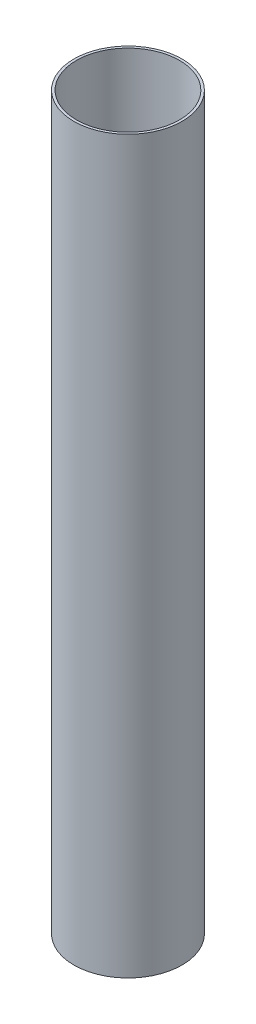
ISO-10303-21;
HEADER;
FILE_DESCRIPTION(('STEP AP214'),'2;1');
FILE_NAME('part.step','',(''),(''),'','','');
FILE_SCHEMA(('AUTOMOTIVE_DESIGN { 1 0 10303 214 1 1 1 1 }'));
ENDSEC;
DATA;
#1=APPLICATION_CONTEXT('core data for automotive mechanical design processes');
#2=APPLICATION_PROTOCOL_DEFINITION('international standard','automotive_design',2000,#1);
#3=PRODUCT_CONTEXT('',#1,'mechanical');
#4=PRODUCT('Part','Part','',(#3));
#5=PRODUCT_RELATED_PRODUCT_CATEGORY('part','',(#4));
#6=PRODUCT_DEFINITION_FORMATION('','',#4);
#7=PRODUCT_DEFINITION_CONTEXT('part definition',#1,'design');
#8=PRODUCT_DEFINITION('design','',#6,#7);
#9=PRODUCT_DEFINITION_SHAPE('','',#8);
#10=(LENGTH_UNIT() NAMED_UNIT(*) SI_UNIT(.MILLI.,.METRE.));
#11=(NAMED_UNIT(*) PLANE_ANGLE_UNIT() SI_UNIT($,.RADIAN.));
#12=(NAMED_UNIT(*) SI_UNIT($,.STERADIAN.) SOLID_ANGLE_UNIT());
#13=UNCERTAINTY_MEASURE_WITH_UNIT(LENGTH_MEASURE(1.E-05),#10,'distance_accuracy_value','');
#14=(GEOMETRIC_REPRESENTATION_CONTEXT(3) GLOBAL_UNCERTAINTY_ASSIGNED_CONTEXT((#13)) GLOBAL_UNIT_ASSIGNED_CONTEXT((#10,
#11,#12)) REPRESENTATION_CONTEXT('',''));
#15=CARTESIAN_POINT('',(0.,0.,0.));
#16=DIRECTION('',(0.,0.,1.));
#17=DIRECTION('',(1.,0.,0.));
#18=AXIS2_PLACEMENT_3D('',#15,#16,#17);
#19=CARTESIAN_POINT('',(0.,-351.,0.));
#20=DIRECTION('',(0.,1.,0.));
#21=DIRECTION('',(0.,0.,1.));
#22=AXIS2_PLACEMENT_3D('',#19,#20,#21);
#23=CYLINDRICAL_SURFACE('',#22,51.95);
#24=CARTESIAN_POINT('',(0.,-351.,0.));
#25=DIRECTION('',(0.,1.,0.));
#26=DIRECTION('',(0.,0.,1.));
#27=AXIS2_PLACEMENT_3D('',#24,#25,#26);
#28=CIRCLE('',#27,51.95);
#29=CARTESIAN_POINT('',(0.,-351.,51.95));
#30=VERTEX_POINT('',#29);
#31=EDGE_CURVE('E10',#30,#30,#28,.T.);
#32=ORIENTED_EDGE('',*,*,#31,.T.);
#33=EDGE_LOOP('',(#32));
#34=FACE_BOUND('',#33,.T.);
#35=CARTESIAN_POINT('',(0.,351.,0.));
#36=DIRECTION('',(0.,1.,0.));
#37=DIRECTION('',(0.,0.,1.));
#38=AXIS2_PLACEMENT_3D('',#35,#36,#37);
#39=CIRCLE('',#38,51.95);
#40=CARTESIAN_POINT('',(0.,351.,51.95));
#41=VERTEX_POINT('',#40);
#42=EDGE_CURVE('E49',#41,#41,#39,.T.);
#43=ORIENTED_EDGE('',*,*,#42,.F.);
#44=EDGE_LOOP('',(#43));
#45=FACE_BOUND('',#44,.T.);
#46=ADVANCED_FACE('F37',(#34,#45),#23,.T.);
#47=CARTESIAN_POINT('',(0.,-351.,0.));
#48=DIRECTION('',(0.,1.,0.));
#49=DIRECTION('',(0.,0.,1.));
#50=AXIS2_PLACEMENT_3D('',#47,#48,#49);
#51=PLANE('',#50);
#52=CARTESIAN_POINT('',(0.,-351.,0.));
#53=DIRECTION('',(0.,1.,0.));
#54=DIRECTION('',(0.,0.,1.));
#55=AXIS2_PLACEMENT_3D('',#52,#53,#54);
#56=CIRCLE('',#55,49.55);
#57=CARTESIAN_POINT('',(0.,-351.,49.55));
#58=VERTEX_POINT('',#57);
#59=EDGE_CURVE('E44',#58,#58,#56,.T.);
#60=ORIENTED_EDGE('',*,*,#59,.T.);
#61=EDGE_LOOP('',(#60));
#62=FACE_BOUND('',#61,.T.);
#63=ORIENTED_EDGE('',*,*,#31,.F.);
#64=EDGE_LOOP('',(#63));
#65=FACE_BOUND('',#64,.T.);
#66=ADVANCED_FACE('F70',(#62,#65),#51,.F.);
#67=CARTESIAN_POINT('',(0.,-351.,0.));
#68=DIRECTION('',(0.,1.,0.));
#69=DIRECTION('',(0.,0.,1.));
#70=AXIS2_PLACEMENT_3D('',#67,#68,#69);
#71=CYLINDRICAL_SURFACE('',#70,49.55);
#72=ORIENTED_EDGE('',*,*,#59,.F.);
#73=EDGE_LOOP('',(#72));
#74=FACE_BOUND('',#73,.T.);
#75=CARTESIAN_POINT('',(0.,351.,0.));
#76=DIRECTION('',(0.,1.,0.));
#77=DIRECTION('',(0.,0.,1.));
#78=AXIS2_PLACEMENT_3D('',#75,#76,#77);
#79=CIRCLE('',#78,49.55);
#80=CARTESIAN_POINT('',(0.,351.,49.55));
#81=VERTEX_POINT('',#80);
#82=EDGE_CURVE('E54',#81,#81,#79,.T.);
#83=ORIENTED_EDGE('',*,*,#82,.T.);
#84=EDGE_LOOP('',(#83));
#85=FACE_BOUND('',#84,.T.);
#86=ADVANCED_FACE('F61',(#74,#85),#71,.F.);
#87=CARTESIAN_POINT('',(0.,351.,0.));
#88=DIRECTION('',(0.,1.,0.));
#89=DIRECTION('',(0.,0.,1.));
#90=AXIS2_PLACEMENT_3D('',#87,#88,#89);
#91=PLANE('',#90);
#92=ORIENTED_EDGE('',*,*,#42,.T.);
#93=EDGE_LOOP('',(#92));
#94=FACE_BOUND('',#93,.T.);
#95=ORIENTED_EDGE('',*,*,#82,.F.);
#96=EDGE_LOOP('',(#95));
#97=FACE_BOUND('',#96,.T.);
#98=ADVANCED_FACE('F63',(#94,#97),#91,.T.);
#99=CLOSED_SHELL('',(#46,#66,#86,#98));
#100=MANIFOLD_SOLID_BREP('B2',#99);
#101=ADVANCED_BREP_SHAPE_REPRESENTATION('',(#18,#100),#14);
#102=SHAPE_DEFINITION_REPRESENTATION(#9,#101);
ENDSEC;
END-ISO-10303-21;
